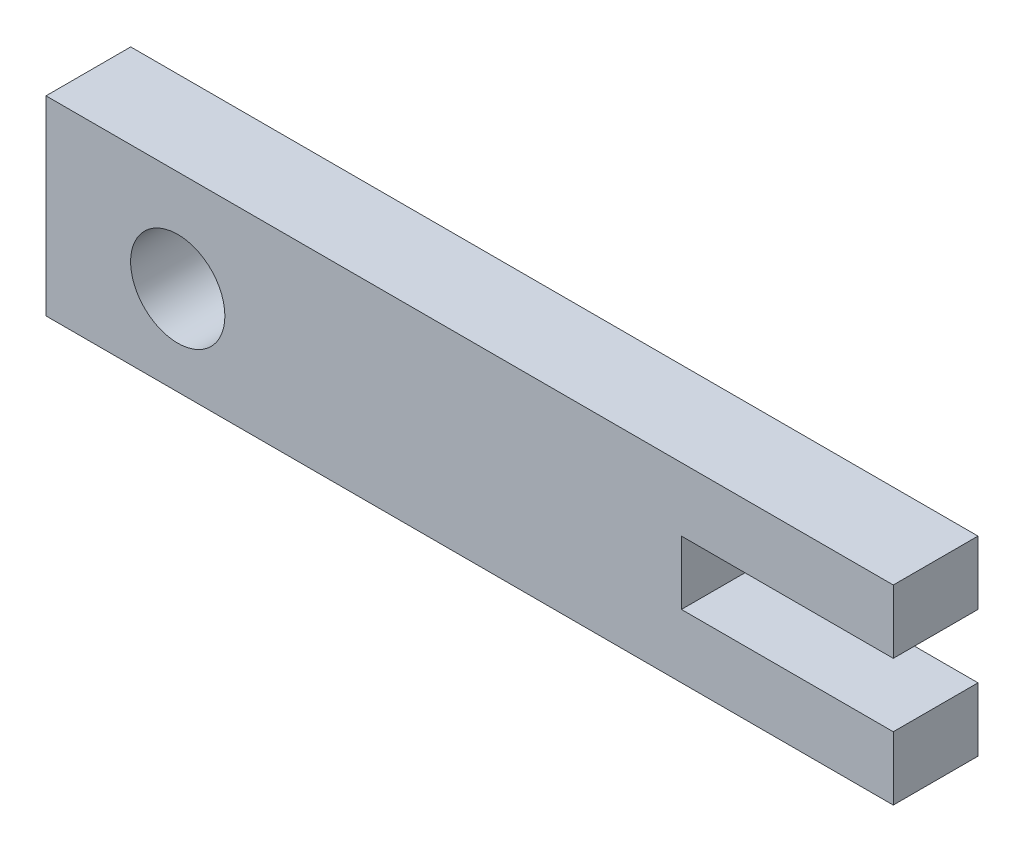
ISO-10303-21;
HEADER;
FILE_DESCRIPTION(('STEP AP214'),'2;1');
FILE_NAME('part.step','',(''),(''),'','','');
FILE_SCHEMA(('AUTOMOTIVE_DESIGN { 1 0 10303 214 1 1 1 1 }'));
ENDSEC;
DATA;
#1=APPLICATION_CONTEXT('core data for automotive mechanical design processes');
#2=APPLICATION_PROTOCOL_DEFINITION('international standard','automotive_design',2000,#1);
#3=PRODUCT_CONTEXT('',#1,'mechanical');
#4=PRODUCT('Part','Part','',(#3));
#5=PRODUCT_RELATED_PRODUCT_CATEGORY('part','',(#4));
#6=PRODUCT_DEFINITION_FORMATION('','',#4);
#7=PRODUCT_DEFINITION_CONTEXT('part definition',#1,'design');
#8=PRODUCT_DEFINITION('design','',#6,#7);
#9=PRODUCT_DEFINITION_SHAPE('','',#8);
#10=(LENGTH_UNIT() NAMED_UNIT(*) SI_UNIT(.MILLI.,.METRE.));
#11=(NAMED_UNIT(*) PLANE_ANGLE_UNIT() SI_UNIT($,.RADIAN.));
#12=(NAMED_UNIT(*) SI_UNIT($,.STERADIAN.) SOLID_ANGLE_UNIT());
#13=UNCERTAINTY_MEASURE_WITH_UNIT(LENGTH_MEASURE(1.E-05),#10,'distance_accuracy_value','');
#14=(GEOMETRIC_REPRESENTATION_CONTEXT(3) GLOBAL_UNCERTAINTY_ASSIGNED_CONTEXT((#13)) GLOBAL_UNIT_ASSIGNED_CONTEXT((#10,
#11,#12)) REPRESENTATION_CONTEXT('',''));
#15=CARTESIAN_POINT('',(0.,0.,0.));
#16=DIRECTION('',(0.,0.,1.));
#17=DIRECTION('',(1.,0.,0.));
#18=AXIS2_PLACEMENT_3D('',#15,#16,#17);
#19=CARTESIAN_POINT('',(-175.,45.,-10.));
#20=DIRECTION('',(0.,0.,1.));
#21=DIRECTION('',(1.,0.,0.));
#22=AXIS2_PLACEMENT_3D('',#19,#20,#21);
#23=PLANE('',#22);
#24=CARTESIAN_POINT('',(-143.9,21.1,-10.));
#25=DIRECTION('',(0.,0.,1.));
#26=DIRECTION('',(1.,0.,0.));
#27=AXIS2_PLACEMENT_3D('',#24,#25,#26);
#28=CIRCLE('',#27,11.125);
#29=CARTESIAN_POINT('',(-132.775,21.1,-10.));
#30=VERTEX_POINT('',#29);
#31=EDGE_CURVE('E113',#30,#30,#28,.T.);
#32=ORIENTED_EDGE('',*,*,#31,.T.);
#33=EDGE_LOOP('',(#32));
#34=FACE_BOUND('',#33,.T.);
#35=DIRECTION('',(0.,1.,0.));
#36=VECTOR('',#35,1.);
#37=CARTESIAN_POINT('',(25.,0.,-10.));
#38=LINE('',#37,#36);
#39=CARTESIAN_POINT('',(25.,30.,-10.));
#40=VERTEX_POINT('',#39);
#41=CARTESIAN_POINT('',(25.,45.,-10.));
#42=VERTEX_POINT('',#41);
#43=EDGE_CURVE('E144',#40,#42,#38,.T.);
#44=ORIENTED_EDGE('',*,*,#43,.F.);
#45=DIRECTION('',(1.,0.,0.));
#46=VECTOR('',#45,1.);
#47=CARTESIAN_POINT('',(0.,30.,-10.));
#48=LINE('',#47,#46);
#49=CARTESIAN_POINT('',(-25.,30.,-10.));
#50=VERTEX_POINT('',#49);
#51=EDGE_CURVE('E171',#50,#40,#48,.T.);
#52=ORIENTED_EDGE('',*,*,#51,.F.);
#53=DIRECTION('',(0.,1.,0.));
#54=VECTOR('',#53,1.);
#55=CARTESIAN_POINT('',(-25.,0.,-10.));
#56=LINE('',#55,#54);
#57=CARTESIAN_POINT('',(-25.,15.,-10.));
#58=VERTEX_POINT('',#57);
#59=EDGE_CURVE('E167',#58,#50,#56,.T.);
#60=ORIENTED_EDGE('',*,*,#59,.F.);
#61=DIRECTION('',(-1.,0.,0.));
#62=VECTOR('',#61,1.);
#63=CARTESIAN_POINT('',(0.,15.,-10.));
#64=LINE('',#63,#62);
#65=CARTESIAN_POINT('',(25.,15.,-10.));
#66=VERTEX_POINT('',#65);
#67=EDGE_CURVE('E163',#66,#58,#64,.T.);
#68=ORIENTED_EDGE('',*,*,#67,.F.);
#69=DIRECTION('',(0.,1.,0.));
#70=VECTOR('',#69,1.);
#71=CARTESIAN_POINT('',(25.,0.,-10.));
#72=LINE('',#71,#70);
#73=CARTESIAN_POINT('',(25.,0.,-10.));
#74=VERTEX_POINT('',#73);
#75=EDGE_CURVE('E126',#74,#66,#72,.T.);
#76=ORIENTED_EDGE('',*,*,#75,.F.);
#77=DIRECTION('',(-1.,0.,0.));
#78=VECTOR('',#77,1.);
#79=CARTESIAN_POINT('',(-175.,0.,-10.));
#80=LINE('',#79,#78);
#81=CARTESIAN_POINT('',(-175.,0.,-10.));
#82=VERTEX_POINT('',#81);
#83=EDGE_CURVE('E90',#74,#82,#80,.T.);
#84=ORIENTED_EDGE('',*,*,#83,.T.);
#85=DIRECTION('',(0.,-1.,0.));
#86=VECTOR('',#85,1.);
#87=CARTESIAN_POINT('',(-175.,45.,-10.));
#88=LINE('',#87,#86);
#89=CARTESIAN_POINT('',(-175.,45.,-10.));
#90=VERTEX_POINT('',#89);
#91=EDGE_CURVE('E11',#90,#82,#88,.T.);
#92=ORIENTED_EDGE('',*,*,#91,.F.);
#93=DIRECTION('',(-1.,0.,0.));
#94=VECTOR('',#93,1.);
#95=CARTESIAN_POINT('',(-175.,45.,-10.));
#96=LINE('',#95,#94);
#97=EDGE_CURVE('E101',#42,#90,#96,.T.);
#98=ORIENTED_EDGE('',*,*,#97,.F.);
#99=EDGE_LOOP('',(#44,#52,#60,#68,#76,#84,#92,#98));
#100=FACE_BOUND('',#99,.T.);
#101=ADVANCED_FACE('F44',(#34,#100),#23,.F.);
#102=CARTESIAN_POINT('',(-175.,45.,10.));
#103=DIRECTION('',(0.,0.,-1.));
#104=DIRECTION('',(-1.,0.,0.));
#105=AXIS2_PLACEMENT_3D('',#102,#103,#104);
#106=PLANE('',#105);
#107=CARTESIAN_POINT('',(-143.9,21.1,10.));
#108=DIRECTION('',(0.,0.,1.));
#109=DIRECTION('',(1.,0.,0.));
#110=AXIS2_PLACEMENT_3D('',#107,#108,#109);
#111=CIRCLE('',#110,11.125);
#112=CARTESIAN_POINT('',(-132.775,21.1,10.));
#113=VERTEX_POINT('',#112);
#114=EDGE_CURVE('E108',#113,#113,#111,.T.);
#115=ORIENTED_EDGE('',*,*,#114,.F.);
#116=EDGE_LOOP('',(#115));
#117=FACE_BOUND('',#116,.T.);
#118=DIRECTION('',(0.,1.,0.));
#119=VECTOR('',#118,1.);
#120=CARTESIAN_POINT('',(25.,0.,10.));
#121=LINE('',#120,#119);
#122=CARTESIAN_POINT('',(25.,30.,10.));
#123=VERTEX_POINT('',#122);
#124=CARTESIAN_POINT('',(25.,45.,10.));
#125=VERTEX_POINT('',#124);
#126=EDGE_CURVE('E157',#123,#125,#121,.T.);
#127=ORIENTED_EDGE('',*,*,#126,.T.);
#128=DIRECTION('',(1.,0.,0.));
#129=VECTOR('',#128,1.);
#130=CARTESIAN_POINT('',(-175.,45.,10.));
#131=LINE('',#130,#129);
#132=CARTESIAN_POINT('',(-175.,45.,10.));
#133=VERTEX_POINT('',#132);
#134=EDGE_CURVE('E96',#133,#125,#131,.T.);
#135=ORIENTED_EDGE('',*,*,#134,.F.);
#136=DIRECTION('',(0.,-1.,0.));
#137=VECTOR('',#136,1.);
#138=CARTESIAN_POINT('',(-175.,45.,10.));
#139=LINE('',#138,#137);
#140=CARTESIAN_POINT('',(-175.,0.,10.));
#141=VERTEX_POINT('',#140);
#142=EDGE_CURVE('E52',#133,#141,#139,.T.);
#143=ORIENTED_EDGE('',*,*,#142,.T.);
#144=DIRECTION('',(1.,0.,0.));
#145=VECTOR('',#144,1.);
#146=CARTESIAN_POINT('',(-175.,0.,10.));
#147=LINE('',#146,#145);
#148=CARTESIAN_POINT('',(25.,0.,10.));
#149=VERTEX_POINT('',#148);
#150=EDGE_CURVE('E89',#141,#149,#147,.T.);
#151=ORIENTED_EDGE('',*,*,#150,.T.);
#152=DIRECTION('',(0.,1.,0.));
#153=VECTOR('',#152,1.);
#154=CARTESIAN_POINT('',(25.,0.,10.));
#155=LINE('',#154,#153);
#156=CARTESIAN_POINT('',(25.,15.,10.));
#157=VERTEX_POINT('',#156);
#158=EDGE_CURVE('E59',#149,#157,#155,.T.);
#159=ORIENTED_EDGE('',*,*,#158,.T.);
#160=DIRECTION('',(-1.,0.,0.));
#161=VECTOR('',#160,1.);
#162=CARTESIAN_POINT('',(0.,15.,10.));
#163=LINE('',#162,#161);
#164=CARTESIAN_POINT('',(-25.,15.,10.));
#165=VERTEX_POINT('',#164);
#166=EDGE_CURVE('E145',#157,#165,#163,.T.);
#167=ORIENTED_EDGE('',*,*,#166,.T.);
#168=DIRECTION('',(0.,1.,0.));
#169=VECTOR('',#168,1.);
#170=CARTESIAN_POINT('',(-25.,0.,10.));
#171=LINE('',#170,#169);
#172=CARTESIAN_POINT('',(-25.,30.,10.));
#173=VERTEX_POINT('',#172);
#174=EDGE_CURVE('E149',#165,#173,#171,.T.);
#175=ORIENTED_EDGE('',*,*,#174,.T.);
#176=DIRECTION('',(1.,0.,0.));
#177=VECTOR('',#176,1.);
#178=CARTESIAN_POINT('',(0.,30.,10.));
#179=LINE('',#178,#177);
#180=EDGE_CURVE('E153',#173,#123,#179,.T.);
#181=ORIENTED_EDGE('',*,*,#180,.T.);
#182=EDGE_LOOP('',(#127,#135,#143,#151,#159,#167,#175,#181));
#183=FACE_BOUND('',#182,.T.);
#184=ADVANCED_FACE('F95',(#117,#183),#106,.F.);
#185=CARTESIAN_POINT('',(0.,45.,0.));
#186=DIRECTION('',(0.,-1.,0.));
#187=DIRECTION('',(0.,0.,-1.));
#188=AXIS2_PLACEMENT_3D('',#185,#186,#187);
#189=PLANE('',#188);
#190=DIRECTION('',(0.,0.,1.));
#191=VECTOR('',#190,1.);
#192=CARTESIAN_POINT('',(25.,45.,-10.));
#193=LINE('',#192,#191);
#194=EDGE_CURVE('E117',#42,#125,#193,.T.);
#195=ORIENTED_EDGE('',*,*,#194,.F.);
#196=ORIENTED_EDGE('',*,*,#97,.T.);
#197=DIRECTION('',(0.,0.,1.));
#198=VECTOR('',#197,1.);
#199=CARTESIAN_POINT('',(-175.,45.,10.));
#200=LINE('',#199,#198);
#201=EDGE_CURVE('E68',#90,#133,#200,.T.);
#202=ORIENTED_EDGE('',*,*,#201,.T.);
#203=ORIENTED_EDGE('',*,*,#134,.T.);
#204=EDGE_LOOP('',(#195,#196,#202,#203));
#205=FACE_BOUND('',#204,.T.);
#206=ADVANCED_FACE('F190',(#205),#189,.F.);
#207=CARTESIAN_POINT('',(0.,0.,0.));
#208=DIRECTION('',(0.,-1.,0.));
#209=DIRECTION('',(0.,0.,-1.));
#210=AXIS2_PLACEMENT_3D('',#207,#208,#209);
#211=PLANE('',#210);
#212=ORIENTED_EDGE('',*,*,#83,.F.);
#213=DIRECTION('',(0.,0.,1.));
#214=VECTOR('',#213,1.);
#215=CARTESIAN_POINT('',(25.,0.,-10.));
#216=LINE('',#215,#214);
#217=EDGE_CURVE('E99',#74,#149,#216,.T.);
#218=ORIENTED_EDGE('',*,*,#217,.T.);
#219=ORIENTED_EDGE('',*,*,#150,.F.);
#220=DIRECTION('',(0.,0.,1.));
#221=VECTOR('',#220,1.);
#222=CARTESIAN_POINT('',(-175.,0.,10.));
#223=LINE('',#222,#221);
#224=EDGE_CURVE('E80',#82,#141,#223,.T.);
#225=ORIENTED_EDGE('',*,*,#224,.F.);
#226=EDGE_LOOP('',(#212,#218,#219,#225));
#227=FACE_BOUND('',#226,.T.);
#228=ADVANCED_FACE('F98',(#227),#211,.T.);
#229=CARTESIAN_POINT('',(-175.,45.,10.));
#230=DIRECTION('',(1.,0.,0.));
#231=DIRECTION('',(0.,0.,-1.));
#232=AXIS2_PLACEMENT_3D('',#229,#230,#231);
#233=PLANE('',#232);
#234=ORIENTED_EDGE('',*,*,#224,.T.);
#235=ORIENTED_EDGE('',*,*,#142,.F.);
#236=ORIENTED_EDGE('',*,*,#201,.F.);
#237=ORIENTED_EDGE('',*,*,#91,.T.);
#238=EDGE_LOOP('',(#234,#235,#236,#237));
#239=FACE_BOUND('',#238,.T.);
#240=ADVANCED_FACE('F82',(#239),#233,.F.);
#241=CARTESIAN_POINT('',(-143.9,21.1,10.));
#242=DIRECTION('',(0.,0.,-1.));
#243=DIRECTION('',(-1.,0.,0.));
#244=AXIS2_PLACEMENT_3D('',#241,#242,#243);
#245=CYLINDRICAL_SURFACE('',#244,11.125);
#246=ORIENTED_EDGE('',*,*,#114,.T.);
#247=EDGE_LOOP('',(#246));
#248=FACE_BOUND('',#247,.T.);
#249=ORIENTED_EDGE('',*,*,#31,.F.);
#250=EDGE_LOOP('',(#249));
#251=FACE_BOUND('',#250,.T.);
#252=ADVANCED_FACE('F239',(#248,#251),#245,.F.);
#253=CARTESIAN_POINT('',(25.,0.,-10.));
#254=DIRECTION('',(1.,0.,0.));
#255=DIRECTION('',(0.,1.,0.));
#256=AXIS2_PLACEMENT_3D('',#253,#254,#255);
#257=PLANE('',#256);
#258=ORIENTED_EDGE('',*,*,#126,.F.);
#259=DIRECTION('',(0.,0.,1.));
#260=VECTOR('',#259,1.);
#261=CARTESIAN_POINT('',(25.,30.,-10.));
#262=LINE('',#261,#260);
#263=EDGE_CURVE('E121',#40,#123,#262,.T.);
#264=ORIENTED_EDGE('',*,*,#263,.F.);
#265=ORIENTED_EDGE('',*,*,#43,.T.);
#266=ORIENTED_EDGE('',*,*,#194,.T.);
#267=EDGE_LOOP('',(#258,#264,#265,#266));
#268=FACE_BOUND('',#267,.T.);
#269=ADVANCED_FACE('F182',(#268),#257,.T.);
#270=CARTESIAN_POINT('',(25.,0.,-10.));
#271=DIRECTION('',(1.,0.,0.));
#272=DIRECTION('',(0.,0.,-1.));
#273=AXIS2_PLACEMENT_3D('',#270,#271,#272);
#274=PLANE('',#273);
#275=ORIENTED_EDGE('',*,*,#158,.F.);
#276=ORIENTED_EDGE('',*,*,#217,.F.);
#277=ORIENTED_EDGE('',*,*,#75,.T.);
#278=DIRECTION('',(0.,0.,1.));
#279=VECTOR('',#278,1.);
#280=CARTESIAN_POINT('',(25.,15.,-10.));
#281=LINE('',#280,#279);
#282=EDGE_CURVE('E134',#66,#157,#281,.T.);
#283=ORIENTED_EDGE('',*,*,#282,.T.);
#284=EDGE_LOOP('',(#275,#276,#277,#283));
#285=FACE_BOUND('',#284,.T.);
#286=ADVANCED_FACE('F246',(#285),#274,.T.);
#287=CARTESIAN_POINT('',(0.,15.,-10.));
#288=DIRECTION('',(0.,1.,0.));
#289=DIRECTION('',(-1.,0.,0.));
#290=AXIS2_PLACEMENT_3D('',#287,#288,#289);
#291=PLANE('',#290);
#292=ORIENTED_EDGE('',*,*,#166,.F.);
#293=ORIENTED_EDGE('',*,*,#282,.F.);
#294=ORIENTED_EDGE('',*,*,#67,.T.);
#295=DIRECTION('',(0.,0.,1.));
#296=VECTOR('',#295,1.);
#297=CARTESIAN_POINT('',(-25.,15.,-10.));
#298=LINE('',#297,#296);
#299=EDGE_CURVE('E130',#58,#165,#298,.T.);
#300=ORIENTED_EDGE('',*,*,#299,.T.);
#301=EDGE_LOOP('',(#292,#293,#294,#300));
#302=FACE_BOUND('',#301,.T.);
#303=ADVANCED_FACE('F215',(#302),#291,.T.);
#304=CARTESIAN_POINT('',(-25.,0.,-10.));
#305=DIRECTION('',(1.,0.,0.));
#306=DIRECTION('',(0.,1.,0.));
#307=AXIS2_PLACEMENT_3D('',#304,#305,#306);
#308=PLANE('',#307);
#309=ORIENTED_EDGE('',*,*,#174,.F.);
#310=ORIENTED_EDGE('',*,*,#299,.F.);
#311=ORIENTED_EDGE('',*,*,#59,.T.);
#312=DIRECTION('',(0.,0.,1.));
#313=VECTOR('',#312,1.);
#314=CARTESIAN_POINT('',(-25.,30.,-10.));
#315=LINE('',#314,#313);
#316=EDGE_CURVE('E125',#50,#173,#315,.T.);
#317=ORIENTED_EDGE('',*,*,#316,.T.);
#318=EDGE_LOOP('',(#309,#310,#311,#317));
#319=FACE_BOUND('',#318,.T.);
#320=ADVANCED_FACE('F219',(#319),#308,.T.);
#321=CARTESIAN_POINT('',(0.,30.,-10.));
#322=DIRECTION('',(0.,-1.,0.));
#323=DIRECTION('',(0.,0.,-1.));
#324=AXIS2_PLACEMENT_3D('',#321,#322,#323);
#325=PLANE('',#324);
#326=ORIENTED_EDGE('',*,*,#180,.F.);
#327=ORIENTED_EDGE('',*,*,#316,.F.);
#328=ORIENTED_EDGE('',*,*,#51,.T.);
#329=ORIENTED_EDGE('',*,*,#263,.T.);
#330=EDGE_LOOP('',(#326,#327,#328,#329));
#331=FACE_BOUND('',#330,.T.);
#332=ADVANCED_FACE('F221',(#331),#325,.T.);
#333=CLOSED_SHELL('',(#101,#184,#206,#228,#240,#252,#269,#286,#303,#320,#332));
#334=MANIFOLD_SOLID_BREP('B2',#333);
#335=ADVANCED_BREP_SHAPE_REPRESENTATION('',(#18,#334),#14);
#336=SHAPE_DEFINITION_REPRESENTATION(#9,#335);
ENDSEC;
END-ISO-10303-21;
